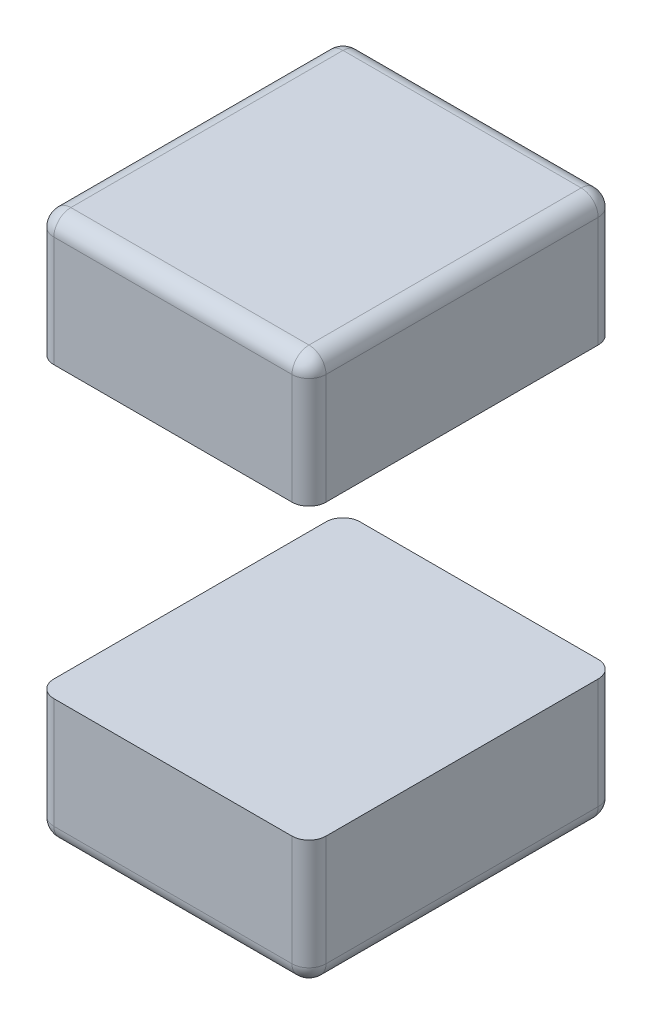
ISO-10303-21;
HEADER;
FILE_DESCRIPTION(('STEP AP214'),'2;1');
FILE_NAME('part.step','',(''),(''),'','','');
FILE_SCHEMA(('AUTOMOTIVE_DESIGN { 1 0 10303 214 1 1 1 1 }'));
ENDSEC;
DATA;
#1=APPLICATION_CONTEXT('core data for automotive mechanical design processes');
#2=APPLICATION_PROTOCOL_DEFINITION('international standard','automotive_design',2000,#1);
#3=PRODUCT_CONTEXT('',#1,'mechanical');
#4=PRODUCT('Part','Part','',(#3));
#5=PRODUCT_RELATED_PRODUCT_CATEGORY('part','',(#4));
#6=PRODUCT_DEFINITION_FORMATION('','',#4);
#7=PRODUCT_DEFINITION_CONTEXT('part definition',#1,'design');
#8=PRODUCT_DEFINITION('design','',#6,#7);
#9=PRODUCT_DEFINITION_SHAPE('','',#8);
#10=(LENGTH_UNIT() NAMED_UNIT(*) SI_UNIT(.MILLI.,.METRE.));
#11=(NAMED_UNIT(*) PLANE_ANGLE_UNIT() SI_UNIT($,.RADIAN.));
#12=(NAMED_UNIT(*) SI_UNIT($,.STERADIAN.) SOLID_ANGLE_UNIT());
#13=UNCERTAINTY_MEASURE_WITH_UNIT(LENGTH_MEASURE(1.E-05),#10,'distance_accuracy_value','');
#14=(GEOMETRIC_REPRESENTATION_CONTEXT(3) GLOBAL_UNCERTAINTY_ASSIGNED_CONTEXT((#13)) GLOBAL_UNIT_ASSIGNED_CONTEXT((#10,
#11,#12)) REPRESENTATION_CONTEXT('',''));
#15=CARTESIAN_POINT('',(0.,0.,0.));
#16=DIRECTION('',(0.,0.,1.));
#17=DIRECTION('',(1.,0.,0.));
#18=AXIS2_PLACEMENT_3D('',#15,#16,#17);
#19=CARTESIAN_POINT('',(18.593926876922,14.522666367789,0.));
#20=DIRECTION('',(4.371138863368E-08,-0.999999999999999,0.));
#21=DIRECTION('',(0.999999999999999,4.371138863368E-08,0.));
#22=AXIS2_PLACEMENT_3D('',#19,#20,#21);
#23=PLANE('',#22);
#24=DIRECTION('',(0.999999999999999,4.371138863368E-08,0.));
#25=VECTOR('',#24,1.);
#26=CARTESIAN_POINT('',(18.7939268769226,14.522666376531,0.85));
#27=LINE('',#26,#25);
#28=CARTESIAN_POINT('',(18.6439268769223,14.5226663699741,0.85));
#29=VERTEX_POINT('',#28);
#30=CARTESIAN_POINT('',(19.3439268769223,14.5226664005721,0.85));
#31=VERTEX_POINT('',#30);
#32=EDGE_CURVE('P0_E183',#29,#31,#27,.T.);
#33=ORIENTED_EDGE('',*,*,#32,.F.);
#34=DIRECTION('',(0.,0.,1.));
#35=VECTOR('',#34,1.);
#36=CARTESIAN_POINT('',(18.643926876922,14.522666369974,0.));
#37=LINE('',#36,#35);
#38=CARTESIAN_POINT('',(18.6439268769223,14.5226663699741,0.05));
#39=VERTEX_POINT('',#38);
#40=EDGE_CURVE('P0_E103',#39,#29,#37,.T.);
#41=ORIENTED_EDGE('',*,*,#40,.F.);
#42=DIRECTION('',(0.999999999999999,4.371138863368E-08,0.));
#43=VECTOR('',#42,1.);
#44=CARTESIAN_POINT('',(18.7939268769226,14.522666376531,0.05));
#45=LINE('',#44,#43);
#46=CARTESIAN_POINT('',(19.3439268769223,14.5226664005721,0.05));
#47=VERTEX_POINT('',#46);
#48=EDGE_CURVE('P0_E175',#47,#39,#45,.F.);
#49=ORIENTED_EDGE('',*,*,#48,.F.);
#50=DIRECTION('',(0.,0.,1.));
#51=VECTOR('',#50,1.);
#52=CARTESIAN_POINT('',(19.343926876922,14.522666400572,0.));
#53=LINE('',#52,#51);
#54=EDGE_CURVE('P0_E179',#31,#47,#53,.F.);
#55=ORIENTED_EDGE('',*,*,#54,.F.);
#56=EDGE_LOOP('',(#33,#41,#49,#55));
#57=FACE_BOUND('',#56,.T.);
#58=ADVANCED_FACE('P0_F17',(#57),#23,.T.);
#59=CARTESIAN_POINT('',(18.643926874737,14.572666369974,0.05));
#60=DIRECTION('',(-0.577350243952805,-0.577350294426266,-0.577350269189805));
#61=DIRECTION('',(0.707106781186693,3.09085931571307E-08,-0.707106781186401));
#62=AXIS2_PLACEMENT_3D('',#59,#60,#61);
#63=SPHERICAL_SURFACE('',#62,0.05);
#64=CARTESIAN_POINT('',(18.6150593625394,14.5437988552527,0.0211324865405095));
#65=VERTEX_POINT('',#64);
#66=VERTEX_LOOP('',#65);
#67=FACE_BOUND('',#66,.T.);
#68=CARTESIAN_POINT('',(18.6439268747363,14.572666369974,0.05));
#69=DIRECTION('',(4.371138837347E-08,-0.999999999999999,0.));
#70=DIRECTION('',(0.999999999999999,4.371138837347E-08,0.));
#71=AXIS2_PLACEMENT_3D('',#68,#69,#70);
#72=CIRCLE('',#71,0.05);
#73=CARTESIAN_POINT('',(18.6439268676332,14.5726663699741,0.));
#74=VERTEX_POINT('',#73);
#75=CARTESIAN_POINT('',(18.5939268747364,14.5726663677887,0.05));
#76=VERTEX_POINT('',#75);
#77=EDGE_CURVE('P0_E98',#74,#76,#72,.F.);
#78=ORIENTED_EDGE('',*,*,#77,.F.);
#79=CARTESIAN_POINT('',(18.6439268747364,14.5726663699743,0.05));
#80=DIRECTION('',(0.999999999999999,4.371138863368E-08,0.));
#81=DIRECTION('',(-4.371138863368E-08,0.999999999999999,0.));
#82=AXIS2_PLACEMENT_3D('',#79,#80,#81);
#83=CIRCLE('',#82,0.05);
#84=EDGE_CURVE('P0_E100',#39,#74,#83,.T.);
#85=ORIENTED_EDGE('',*,*,#84,.F.);
#86=CARTESIAN_POINT('',(18.643926874737,14.572666369974,0.05));
#87=DIRECTION('',(0.,0.,1.));
#88=DIRECTION('',(1.,0.,0.));
#89=AXIS2_PLACEMENT_3D('',#86,#87,#88);
#90=CIRCLE('',#89,0.05);
#91=EDGE_CURVE('P0_E20',#76,#39,#90,.T.);
#92=ORIENTED_EDGE('',*,*,#91,.F.);
#93=EDGE_LOOP('',(#78,#85,#92));
#94=FACE_BOUND('',#93,.T.);
#95=ADVANCED_FACE('P0_F97',(#67,#94),#63,.T.);
#96=CARTESIAN_POINT('',(18.643926874737,14.572666369974,0.));
#97=DIRECTION('',(0.,0.,1.));
#98=DIRECTION('',(1.,0.,0.));
#99=AXIS2_PLACEMENT_3D('',#96,#97,#98);
#100=CYLINDRICAL_SURFACE('',#99,0.05);
#101=ORIENTED_EDGE('',*,*,#91,.T.);
#102=ORIENTED_EDGE('',*,*,#40,.T.);
#103=CARTESIAN_POINT('',(18.643926874737,14.572666369974,0.85));
#104=DIRECTION('',(0.,0.,1.));
#105=DIRECTION('',(1.,0.,0.));
#106=AXIS2_PLACEMENT_3D('',#103,#104,#105);
#107=CIRCLE('',#106,0.05);
#108=CARTESIAN_POINT('',(18.5939268747364,14.5726663677887,0.85));
#109=VERTEX_POINT('',#108);
#110=EDGE_CURVE('P0_E118',#109,#29,#107,.T.);
#111=ORIENTED_EDGE('',*,*,#110,.F.);
#112=DIRECTION('',(0.,0.,1.));
#113=VECTOR('',#112,1.);
#114=CARTESIAN_POINT('',(18.5939268747362,14.572666367789,0.));
#115=LINE('',#114,#113);
#116=EDGE_CURVE('P0_E115',#76,#109,#115,.T.);
#117=ORIENTED_EDGE('',*,*,#116,.F.);
#118=EDGE_LOOP('',(#101,#102,#111,#117));
#119=FACE_BOUND('',#118,.T.);
#120=ADVANCED_FACE('P0_F116',(#119),#100,.T.);
#121=CARTESIAN_POINT('',(18.643926874737,14.572666369974,0.85));
#122=DIRECTION('',(-0.577350243952984,-0.577350294425946,0.577350269189946));
#123=DIRECTION('',(3.09081850113912E-08,-0.707106781186808,-0.707106781186286));
#124=AXIS2_PLACEMENT_3D('',#121,#122,#123);
#125=SPHERICAL_SURFACE('',#124,0.05);
#126=CARTESIAN_POINT('',(18.6150593625394,14.5437988552527,0.878867513459497));
#127=VERTEX_POINT('',#126);
#128=VERTEX_LOOP('',#127);
#129=FACE_BOUND('',#128,.T.);
#130=ORIENTED_EDGE('',*,*,#110,.T.);
#131=CARTESIAN_POINT('',(18.643926874737,14.5726663699743,0.85));
#132=DIRECTION('',(0.999999999999999,4.371138863368E-08,0.));
#133=DIRECTION('',(-4.371138863368E-08,0.999999999999999,0.));
#134=AXIS2_PLACEMENT_3D('',#131,#132,#133);
#135=CIRCLE('',#134,0.05);
#136=CARTESIAN_POINT('',(18.6439268676335,14.5726663699743,0.9));
#137=VERTEX_POINT('',#136);
#138=EDGE_CURVE('P0_E186',#137,#29,#135,.T.);
#139=ORIENTED_EDGE('',*,*,#138,.F.);
#140=CARTESIAN_POINT('',(18.6439268747363,14.5726663699746,0.85));
#141=DIRECTION('',(4.371138837347E-08,-0.999999999999999,0.));
#142=DIRECTION('',(0.999999999999999,4.371138837347E-08,0.));
#143=AXIS2_PLACEMENT_3D('',#140,#141,#142);
#144=CIRCLE('',#143,0.05);
#145=EDGE_CURVE('P0_E206',#109,#137,#144,.F.);
#146=ORIENTED_EDGE('',*,*,#145,.F.);
#147=EDGE_LOOP('',(#130,#139,#146));
#148=FACE_BOUND('',#147,.T.);
#149=ADVANCED_FACE('P0_F166',(#129,#148),#125,.T.);
#150=CARTESIAN_POINT('',(18.793926874737,14.572666376531,0.85));
#151=DIRECTION('',(0.999999999999999,4.371138863368E-08,0.));
#152=DIRECTION('',(-4.371138863368E-08,0.999999999999999,0.));
#153=AXIS2_PLACEMENT_3D('',#150,#151,#152);
#154=CYLINDRICAL_SURFACE('',#153,0.05);
#155=ORIENTED_EDGE('',*,*,#138,.T.);
#156=ORIENTED_EDGE('',*,*,#32,.T.);
#157=CARTESIAN_POINT('',(19.3439268747364,14.5726664005723,0.85));
#158=DIRECTION('',(0.999999999999999,4.371138863368E-08,0.));
#159=DIRECTION('',(-4.371138863368E-08,0.999999999999999,0.));
#160=AXIS2_PLACEMENT_3D('',#157,#158,#159);
#161=CIRCLE('',#160,0.05);
#162=CARTESIAN_POINT('',(19.3439268747367,14.5726663852731,0.9));
#163=VERTEX_POINT('',#162);
#164=EDGE_CURVE('P0_E185',#163,#31,#161,.T.);
#165=ORIENTED_EDGE('',*,*,#164,.F.);
#166=DIRECTION('',(1.,0.,0.));
#167=VECTOR('',#166,1.);
#168=CARTESIAN_POINT('',(18.993926868726,14.572666369974,0.9));
#169=LINE('',#168,#167);
#170=EDGE_CURVE('P0_E159',#137,#163,#169,.T.);
#171=ORIENTED_EDGE('',*,*,#170,.F.);
#172=EDGE_LOOP('',(#155,#156,#165,#171));
#173=FACE_BOUND('',#172,.T.);
#174=ADVANCED_FACE('P0_F154',(#173),#154,.T.);
#175=CARTESIAN_POINT('',(19.343926874737,14.572666400572,0.85));
#176=DIRECTION('',(0.577350294426125,-0.577350243953125,0.577350269189626));
#177=DIRECTION('',(-0.707106750278215,-0.707106812094878,-1.15130127653629E-13));
#178=AXIS2_PLACEMENT_3D('',#175,#176,#177);
#179=SPHERICAL_SURFACE('',#178,0.05);
#180=CARTESIAN_POINT('',(19.3727943894583,14.5437988883743,0.878867513459482));
#181=VERTEX_POINT('',#180);
#182=VERTEX_LOOP('',#181);
#183=FACE_BOUND('',#182,.T.);
#184=CARTESIAN_POINT('',(19.343926874737,14.572666400572,0.85));
#185=DIRECTION('',(0.,0.,1.));
#186=DIRECTION('',(1.,0.,0.));
#187=AXIS2_PLACEMENT_3D('',#184,#185,#186);
#188=CIRCLE('',#187,0.05);
#189=CARTESIAN_POINT('',(19.3939268747366,14.5726664027578,0.85));
#190=VERTEX_POINT('',#189);
#191=EDGE_CURVE('P0_E182',#190,#31,#188,.F.);
#192=ORIENTED_EDGE('',*,*,#191,.F.);
#193=CARTESIAN_POINT('',(19.3439268747364,14.572666400572,0.85));
#194=DIRECTION('',(-4.371138833011E-08,0.999999999999999,0.));
#195=DIRECTION('',(-0.999999999999999,-4.371138833011E-08,0.));
#196=AXIS2_PLACEMENT_3D('',#193,#194,#195);
#197=CIRCLE('',#196,0.05);
#198=EDGE_CURVE('P0_E202',#163,#190,#197,.T.);
#199=ORIENTED_EDGE('',*,*,#198,.F.);
#200=ORIENTED_EDGE('',*,*,#164,.T.);
#201=EDGE_LOOP('',(#192,#199,#200));
#202=FACE_BOUND('',#201,.T.);
#203=ADVANCED_FACE('P0_F150',(#183,#202),#179,.T.);
#204=CARTESIAN_POINT('',(19.343926874737,14.572666400572,0.));
#205=DIRECTION('',(0.,0.,1.));
#206=DIRECTION('',(1.,0.,0.));
#207=AXIS2_PLACEMENT_3D('',#204,#205,#206);
#208=CYLINDRICAL_SURFACE('',#207,0.05);
#209=CARTESIAN_POINT('',(19.343926874737,14.572666400572,0.05));
#210=DIRECTION('',(0.,0.,1.));
#211=DIRECTION('',(1.,0.,0.));
#212=AXIS2_PLACEMENT_3D('',#209,#210,#211);
#213=CIRCLE('',#212,0.05);
#214=CARTESIAN_POINT('',(19.3939268747365,14.5726664027578,0.05));
#215=VERTEX_POINT('',#214);
#216=EDGE_CURVE('P0_E181',#215,#47,#213,.F.);
#217=ORIENTED_EDGE('',*,*,#216,.F.);
#218=DIRECTION('',(0.,0.,1.));
#219=VECTOR('',#218,1.);
#220=CARTESIAN_POINT('',(19.3939268747364,14.572666402758,0.));
#221=LINE('',#220,#219);
#222=EDGE_CURVE('P0_E137',#190,#215,#221,.F.);
#223=ORIENTED_EDGE('',*,*,#222,.F.);
#224=ORIENTED_EDGE('',*,*,#191,.T.);
#225=ORIENTED_EDGE('',*,*,#54,.T.);
#226=EDGE_LOOP('',(#217,#223,#224,#225));
#227=FACE_BOUND('',#226,.T.);
#228=ADVANCED_FACE('P0_F145',(#227),#208,.T.);
#229=CARTESIAN_POINT('',(19.343926874737,14.572666400572,0.05));
#230=DIRECTION('',(0.577350294426125,-0.577350243953125,-0.577350269189626));
#231=DIRECTION('',(-0.707106750278215,-0.707106812094878,1.15130127653629E-13));
#232=AXIS2_PLACEMENT_3D('',#229,#230,#231);
#233=SPHERICAL_SURFACE('',#232,0.05);
#234=CARTESIAN_POINT('',(19.3727943894583,14.5437988883743,0.0211324865405184));
#235=VERTEX_POINT('',#234);
#236=VERTEX_LOOP('',#235);
#237=FACE_BOUND('',#236,.T.);
#238=CARTESIAN_POINT('',(19.3439268747364,14.5726664005724,0.05));
#239=DIRECTION('',(-4.371138833011E-08,0.999999999999999,0.));
#240=DIRECTION('',(-0.999999999999999,-4.371138833011E-08,0.));
#241=AXIS2_PLACEMENT_3D('',#238,#239,#240);
#242=CIRCLE('',#241,0.05);
#243=CARTESIAN_POINT('',(19.343926874737,14.5726663852732,0.));
#244=VERTEX_POINT('',#243);
#245=EDGE_CURVE('P0_E134',#215,#244,#242,.T.);
#246=ORIENTED_EDGE('',*,*,#245,.F.);
#247=ORIENTED_EDGE('',*,*,#216,.T.);
#248=CARTESIAN_POINT('',(19.343926874737,14.5726664005723,0.05));
#249=DIRECTION('',(0.999999999999999,4.371138863368E-08,0.));
#250=DIRECTION('',(-4.371138863368E-08,0.999999999999999,0.));
#251=AXIS2_PLACEMENT_3D('',#248,#249,#250);
#252=CIRCLE('',#251,0.05);
#253=EDGE_CURVE('P0_E178',#244,#47,#252,.F.);
#254=ORIENTED_EDGE('',*,*,#253,.F.);
#255=EDGE_LOOP('',(#246,#247,#254));
#256=FACE_BOUND('',#255,.T.);
#257=ADVANCED_FACE('P0_F140',(#237,#256),#233,.T.);
#258=CARTESIAN_POINT('',(18.793926874737,14.572666376531,0.05));
#259=DIRECTION('',(0.999999999999999,4.371138863368E-08,0.));
#260=DIRECTION('',(-4.371138863368E-08,0.999999999999999,0.));
#261=AXIS2_PLACEMENT_3D('',#258,#259,#260);
#262=CYLINDRICAL_SURFACE('',#261,0.05);
#263=ORIENTED_EDGE('',*,*,#84,.T.);
#264=DIRECTION('',(1.,0.,0.));
#265=VECTOR('',#264,1.);
#266=CARTESIAN_POINT('',(18.993926868726,14.572666369974,0.));
#267=LINE('',#266,#265);
#268=EDGE_CURVE('P0_E131',#74,#244,#267,.T.);
#269=ORIENTED_EDGE('',*,*,#268,.T.);
#270=ORIENTED_EDGE('',*,*,#253,.T.);
#271=ORIENTED_EDGE('',*,*,#48,.T.);
#272=EDGE_LOOP('',(#263,#269,#270,#271));
#273=FACE_BOUND('',#272,.T.);
#274=ADVANCED_FACE('P0_F144',(#273),#262,.T.);
#275=CARTESIAN_POINT('',(18.643926864628,14.803916369974,0.05));
#276=DIRECTION('',(4.371138837347E-08,-0.999999999999999,0.));
#277=DIRECTION('',(0.999999999999999,4.371138837347E-08,0.));
#278=AXIS2_PLACEMENT_3D('',#275,#276,#277);
#279=CYLINDRICAL_SURFACE('',#278,0.05);
#280=ORIENTED_EDGE('',*,*,#77,.T.);
#281=DIRECTION('',(4.371138837347E-08,-0.999999999999999,0.));
#282=VECTOR('',#281,1.);
#283=CARTESIAN_POINT('',(18.59392686053,14.897666367789,0.05));
#284=LINE('',#283,#282);
#285=CARTESIAN_POINT('',(18.59392686053,14.8976663677889,0.05));
#286=VERTEX_POINT('',#285);
#287=EDGE_CURVE('P0_E108',#286,#76,#284,.T.);
#288=ORIENTED_EDGE('',*,*,#287,.F.);
#289=CARTESIAN_POINT('',(18.6439268605301,14.8976663699746,0.05));
#290=DIRECTION('',(4.371138837347E-08,-0.999999999999999,0.));
#291=DIRECTION('',(0.999999999999999,4.371138837347E-08,0.));
#292=AXIS2_PLACEMENT_3D('',#289,#290,#291);
#293=CIRCLE('',#292,0.05);
#294=CARTESIAN_POINT('',(18.64392686053,14.8976663699745,0.));
#295=VERTEX_POINT('',#294);
#296=EDGE_CURVE('P0_E198',#295,#286,#293,.F.);
#297=ORIENTED_EDGE('',*,*,#296,.F.);
#298=DIRECTION('',(0.,1.,0.));
#299=VECTOR('',#298,1.);
#300=CARTESIAN_POINT('',(18.64392686053,14.710166385273,0.));
#301=LINE('',#300,#299);
#302=EDGE_CURVE('P0_E111',#295,#74,#301,.F.);
#303=ORIENTED_EDGE('',*,*,#302,.T.);
#304=EDGE_LOOP('',(#280,#288,#297,#303));
#305=FACE_BOUND('',#304,.T.);
#306=ADVANCED_FACE('P0_F106',(#305),#279,.T.);
#307=CARTESIAN_POINT('',(18.59392686053,14.897666367789,0.));
#308=DIRECTION('',(-0.999999999999999,-4.371138837347E-08,0.));
#309=DIRECTION('',(4.371138837347E-08,-0.999999999999999,0.));
#310=AXIS2_PLACEMENT_3D('',#307,#308,#309);
#311=PLANE('',#310);
#312=DIRECTION('',(4.371138837347E-08,-0.999999999999999,0.));
#313=VECTOR('',#312,1.);
#314=CARTESIAN_POINT('',(18.593926864628,14.8039163677884,0.85));
#315=LINE('',#314,#313);
#316=CARTESIAN_POINT('',(18.59392686053,14.8976663677887,0.85));
#317=VERTEX_POINT('',#316);
#318=EDGE_CURVE('P0_E121',#317,#109,#315,.T.);
#319=ORIENTED_EDGE('',*,*,#318,.F.);
#320=DIRECTION('',(0.,0.,1.));
#321=VECTOR('',#320,1.);
#322=CARTESIAN_POINT('',(18.59392686053,14.8976663677889,0.));
#323=LINE('',#322,#321);
#324=EDGE_CURVE('P0_E125',#286,#317,#323,.T.);
#325=ORIENTED_EDGE('',*,*,#324,.F.);
#326=ORIENTED_EDGE('',*,*,#287,.T.);
#327=ORIENTED_EDGE('',*,*,#116,.T.);
#328=EDGE_LOOP('',(#319,#325,#326,#327));
#329=FACE_BOUND('',#328,.T.);
#330=ADVANCED_FACE('P0_F123',(#329),#311,.T.);
#331=CARTESIAN_POINT('',(18.643926864628,14.803916369974,0.85));
#332=DIRECTION('',(4.371138837347E-08,-0.999999999999999,0.));
#333=DIRECTION('',(0.999999999999999,4.371138837347E-08,0.));
#334=AXIS2_PLACEMENT_3D('',#331,#332,#333);
#335=CYLINDRICAL_SURFACE('',#334,0.05);
#336=ORIENTED_EDGE('',*,*,#145,.T.);
#337=DIRECTION('',(0.,1.,0.));
#338=VECTOR('',#337,1.);
#339=CARTESIAN_POINT('',(18.64392686053,14.710166385273,0.9));
#340=LINE('',#339,#338);
#341=CARTESIAN_POINT('',(18.64392686053,14.8976663699742,0.9));
#342=VERTEX_POINT('',#341);
#343=EDGE_CURVE('P0_E163',#342,#137,#340,.F.);
#344=ORIENTED_EDGE('',*,*,#343,.F.);
#345=CARTESIAN_POINT('',(18.6439268605301,14.897666369974,0.85));
#346=DIRECTION('',(4.371138837347E-08,-0.999999999999999,0.));
#347=DIRECTION('',(0.999999999999999,4.371138837347E-08,0.));
#348=AXIS2_PLACEMENT_3D('',#345,#346,#347);
#349=CIRCLE('',#348,0.05);
#350=EDGE_CURVE('P0_E195',#317,#342,#349,.F.);
#351=ORIENTED_EDGE('',*,*,#350,.F.);
#352=ORIENTED_EDGE('',*,*,#318,.T.);
#353=EDGE_LOOP('',(#336,#344,#351,#352));
#354=FACE_BOUND('',#353,.T.);
#355=ADVANCED_FACE('P0_F311',(#354),#335,.T.);
#356=CARTESIAN_POINT('',(18.993926868726,14.710166385273,0.9));
#357=DIRECTION('',(0.,0.,1.));
#358=DIRECTION('',(1.,0.,0.));
#359=AXIS2_PLACEMENT_3D('',#356,#357,#358);
#360=PLANE('',#359);
#361=DIRECTION('',(-4.371138833011E-08,0.999999999999999,0.));
#362=VECTOR('',#361,1.);
#363=CARTESIAN_POINT('',(19.3439268728238,14.616416400572,0.9));
#364=LINE('',#363,#362);
#365=CARTESIAN_POINT('',(19.3439268605301,14.8976664005724,0.9));
#366=VERTEX_POINT('',#365);
#367=EDGE_CURVE('P0_E162',#366,#163,#364,.F.);
#368=ORIENTED_EDGE('',*,*,#367,.F.);
#369=DIRECTION('',(-0.999999999999999,-4.371138828674E-08,0.));
#370=VECTOR('',#369,1.);
#371=CARTESIAN_POINT('',(19.39392686053,14.897666402758,0.9));
#372=LINE('',#371,#370);
#373=EDGE_CURVE('P0_E194',#342,#366,#372,.F.);
#374=ORIENTED_EDGE('',*,*,#373,.F.);
#375=ORIENTED_EDGE('',*,*,#343,.T.);
#376=ORIENTED_EDGE('',*,*,#170,.T.);
#377=EDGE_LOOP('',(#368,#374,#375,#376));
#378=FACE_BOUND('',#377,.T.);
#379=ADVANCED_FACE('P0_F232',(#378),#360,.T.);
#380=CARTESIAN_POINT('',(19.343926872824,14.616416400572,0.85));
#381=DIRECTION('',(-4.371138833011E-08,0.999999999999999,0.));
#382=DIRECTION('',(-0.999999999999999,-4.371138833011E-08,0.));
#383=AXIS2_PLACEMENT_3D('',#380,#381,#382);
#384=CYLINDRICAL_SURFACE('',#383,0.05);
#385=ORIENTED_EDGE('',*,*,#198,.T.);
#386=DIRECTION('',(-4.371138833011E-08,0.999999999999999,0.));
#387=VECTOR('',#386,1.);
#388=CARTESIAN_POINT('',(19.393926876922,14.522666402758,0.85));
#389=LINE('',#388,#387);
#390=CARTESIAN_POINT('',(19.3939268605301,14.897666402758,0.85));
#391=VERTEX_POINT('',#390);
#392=EDGE_CURVE('P0_E205',#391,#190,#389,.F.);
#393=ORIENTED_EDGE('',*,*,#392,.F.);
#394=CARTESIAN_POINT('',(19.3439268605302,14.8976664005724,0.85));
#395=DIRECTION('',(-4.371138833011E-08,0.999999999999999,0.));
#396=DIRECTION('',(-0.999999999999999,-4.371138833011E-08,0.));
#397=AXIS2_PLACEMENT_3D('',#394,#395,#396);
#398=CIRCLE('',#397,0.05);
#399=EDGE_CURVE('P0_E191',#366,#391,#398,.T.);
#400=ORIENTED_EDGE('',*,*,#399,.F.);
#401=ORIENTED_EDGE('',*,*,#367,.T.);
#402=EDGE_LOOP('',(#385,#393,#400,#401));
#403=FACE_BOUND('',#402,.T.);
#404=ADVANCED_FACE('P0_F268',(#403),#384,.T.);
#405=CARTESIAN_POINT('',(19.393926876922,14.522666402758,0.));
#406=DIRECTION('',(0.999999999999999,4.371138833011E-08,0.));
#407=DIRECTION('',(-4.371138833011E-08,0.999999999999999,0.));
#408=AXIS2_PLACEMENT_3D('',#405,#406,#407);
#409=PLANE('',#408);
#410=ORIENTED_EDGE('',*,*,#392,.T.);
#411=ORIENTED_EDGE('',*,*,#222,.T.);
#412=DIRECTION('',(-4.371138833011E-08,0.999999999999999,0.));
#413=VECTOR('',#412,1.);
#414=CARTESIAN_POINT('',(19.393926872824,14.6164164027576,0.05));
#415=LINE('',#414,#413);
#416=CARTESIAN_POINT('',(19.39392686053,14.8976664027578,0.05));
#417=VERTEX_POINT('',#416);
#418=EDGE_CURVE('P0_E201',#417,#215,#415,.F.);
#419=ORIENTED_EDGE('',*,*,#418,.F.);
#420=DIRECTION('',(0.,0.,1.));
#421=VECTOR('',#420,1.);
#422=CARTESIAN_POINT('',(19.39392686053,14.897666402758,0.));
#423=LINE('',#422,#421);
#424=EDGE_CURVE('P0_E190',#391,#417,#423,.F.);
#425=ORIENTED_EDGE('',*,*,#424,.F.);
#426=EDGE_LOOP('',(#410,#411,#419,#425));
#427=FACE_BOUND('',#426,.T.);
#428=ADVANCED_FACE('P0_F253',(#427),#409,.T.);
#429=CARTESIAN_POINT('',(19.343926872824,14.616416400572,0.05));
#430=DIRECTION('',(-4.371138833011E-08,0.999999999999999,0.));
#431=DIRECTION('',(-0.999999999999999,-4.371138833011E-08,0.));
#432=AXIS2_PLACEMENT_3D('',#429,#430,#431);
#433=CYLINDRICAL_SURFACE('',#432,0.05);
#434=ORIENTED_EDGE('',*,*,#245,.T.);
#435=DIRECTION('',(0.,1.,0.));
#436=VECTOR('',#435,1.);
#437=CARTESIAN_POINT('',(19.343926874737,14.710166385273,0.));
#438=LINE('',#437,#436);
#439=CARTESIAN_POINT('',(19.3439268676336,14.8976664005722,0.));
#440=VERTEX_POINT('',#439);
#441=EDGE_CURVE('P0_E35',#244,#440,#438,.T.);
#442=ORIENTED_EDGE('',*,*,#441,.T.);
#443=CARTESIAN_POINT('',(19.3439268605302,14.897666400572,0.05));
#444=DIRECTION('',(-4.371138833011E-08,0.999999999999999,0.));
#445=DIRECTION('',(-0.999999999999999,-4.371138833011E-08,0.));
#446=AXIS2_PLACEMENT_3D('',#443,#444,#445);
#447=CIRCLE('',#446,0.05);
#448=EDGE_CURVE('P0_E26',#417,#440,#447,.T.);
#449=ORIENTED_EDGE('',*,*,#448,.F.);
#450=ORIENTED_EDGE('',*,*,#418,.T.);
#451=EDGE_LOOP('',(#434,#442,#449,#450));
#452=FACE_BOUND('',#451,.T.);
#453=ADVANCED_FACE('P0_F257',(#452),#433,.T.);
#454=CARTESIAN_POINT('',(18.993926868726,14.710166385273,0.));
#455=DIRECTION('',(0.,0.,1.));
#456=DIRECTION('',(1.,0.,0.));
#457=AXIS2_PLACEMENT_3D('',#454,#455,#456);
#458=PLANE('',#457);
#459=DIRECTION('',(-0.999999999999999,-4.371138828674E-08,0.));
#460=VECTOR('',#459,1.);
#461=CARTESIAN_POINT('',(19.39392686053,14.897666402758,0.));
#462=LINE('',#461,#460);
#463=EDGE_CURVE('P0_E11',#440,#295,#462,.T.);
#464=ORIENTED_EDGE('',*,*,#463,.F.);
#465=ORIENTED_EDGE('',*,*,#441,.F.);
#466=ORIENTED_EDGE('',*,*,#268,.F.);
#467=ORIENTED_EDGE('',*,*,#302,.F.);
#468=EDGE_LOOP('',(#464,#465,#466,#467));
#469=FACE_BOUND('',#468,.T.);
#470=ADVANCED_FACE('P0_F259',(#469),#458,.F.);
#471=CARTESIAN_POINT('',(19.39392686053,14.897666402758,0.));
#472=DIRECTION('',(-4.371138828674E-08,0.999999999999999,0.));
#473=DIRECTION('',(-0.999999999999999,-4.371138828674E-08,0.));
#474=AXIS2_PLACEMENT_3D('',#471,#472,#473);
#475=PLANE('',#474);
#476=ORIENTED_EDGE('',*,*,#448,.T.);
#477=ORIENTED_EDGE('',*,*,#463,.T.);
#478=ORIENTED_EDGE('',*,*,#296,.T.);
#479=ORIENTED_EDGE('',*,*,#324,.T.);
#480=ORIENTED_EDGE('',*,*,#350,.T.);
#481=ORIENTED_EDGE('',*,*,#373,.T.);
#482=ORIENTED_EDGE('',*,*,#399,.T.);
#483=ORIENTED_EDGE('',*,*,#424,.T.);
#484=EDGE_LOOP('',(#476,#477,#478,#479,#480,#481,#482,#483));
#485=FACE_BOUND('',#484,.T.);
#486=ADVANCED_FACE('P0_F250',(#485),#475,.T.);
#487=CLOSED_SHELL('',(#58,#95,#120,#149,#174,#203,#228,#257,#274,#306,#330,#355,#379,#404,#428,
#453,#470,#486));
#488=MANIFOLD_SOLID_BREP('P0_B1',#487);
#489=CARTESIAN_POINT('',(19.393926806984,16.122666402758,0.));
#490=DIRECTION('',(-4.371138828674E-08,0.999999999999999,0.));
#491=DIRECTION('',(-0.999999999999999,-4.371138828674E-08,0.));
#492=AXIS2_PLACEMENT_3D('',#489,#490,#491);
#493=PLANE('',#492);
#494=DIRECTION('',(-0.999999999999999,-4.371138828674E-08,0.));
#495=VECTOR('',#494,1.);
#496=CARTESIAN_POINT('',(19.1939268069844,16.122666394016,0.85));
#497=LINE('',#496,#495);
#498=CARTESIAN_POINT('',(19.3439268069842,16.1226664005724,0.85));
#499=VERTEX_POINT('',#498);
#500=CARTESIAN_POINT('',(18.6439268069842,16.1226663699744,0.85));
#501=VERTEX_POINT('',#500);
#502=EDGE_CURVE('P1_E180',#499,#501,#497,.T.);
#503=ORIENTED_EDGE('',*,*,#502,.F.);
#504=DIRECTION('',(0.,0.,1.));
#505=VECTOR('',#504,1.);
#506=CARTESIAN_POINT('',(19.343926806984,16.122666400572,0.));
#507=LINE('',#506,#505);
#508=CARTESIAN_POINT('',(19.3439268069842,16.1226664005724,0.05));
#509=VERTEX_POINT('',#508);
#510=EDGE_CURVE('P1_E184',#509,#499,#507,.T.);
#511=ORIENTED_EDGE('',*,*,#510,.F.);
#512=DIRECTION('',(-0.999999999999999,-4.371138828674E-08,0.));
#513=VECTOR('',#512,1.);
#514=CARTESIAN_POINT('',(19.1939268069844,16.122666394016,0.05));
#515=LINE('',#514,#513);
#516=CARTESIAN_POINT('',(18.6439268069842,16.1226663699744,0.05));
#517=VERTEX_POINT('',#516);
#518=EDGE_CURVE('P1_E104',#517,#509,#515,.F.);
#519=ORIENTED_EDGE('',*,*,#518,.F.);
#520=DIRECTION('',(0.,0.,1.));
#521=VECTOR('',#520,1.);
#522=CARTESIAN_POINT('',(18.643926806984,16.122666369974,0.));
#523=LINE('',#522,#521);
#524=EDGE_CURVE('P1_E176',#501,#517,#523,.F.);
#525=ORIENTED_EDGE('',*,*,#524,.F.);
#526=EDGE_LOOP('',(#503,#511,#519,#525));
#527=FACE_BOUND('',#526,.T.);
#528=ADVANCED_FACE('P1_F17',(#527),#493,.T.);
#529=CARTESIAN_POINT('',(18.64392680917,16.072666369974,0.05));
#530=DIRECTION('',(-0.577350294425946,0.577350243952984,-0.577350269189946));
#531=DIRECTION('',(0.707106781186808,3.09081850113912E-08,-0.707106781186286));
#532=AXIS2_PLACEMENT_3D('',#529,#530,#531);
#533=SPHERICAL_SURFACE('',#532,0.05);
#534=CARTESIAN_POINT('',(18.6150592944487,16.1015338821717,0.0211324865405037));
#535=VERTEX_POINT('',#534);
#536=VERTEX_LOOP('',#535);
#537=FACE_BOUND('',#536,.T.);
#538=CARTESIAN_POINT('',(18.64392680917,16.0726663699747,0.05));
#539=DIRECTION('',(-0.999999999999999,-4.371138828674E-08,0.));
#540=DIRECTION('',(4.371138828674E-08,-0.999999999999999,0.));
#541=AXIS2_PLACEMENT_3D('',#538,#539,#540);
#542=CIRCLE('',#541,0.05);
#543=CARTESIAN_POINT('',(18.64392680917,16.072666385273,0.));
#544=VERTEX_POINT('',#543);
#545=EDGE_CURVE('P1_E20',#544,#517,#542,.F.);
#546=ORIENTED_EDGE('',*,*,#545,.F.);
#547=CARTESIAN_POINT('',(18.6439268091696,16.0726663699746,0.05));
#548=DIRECTION('',(4.371138837347E-08,-0.999999999999999,0.));
#549=DIRECTION('',(0.999999999999999,4.371138837347E-08,0.));
#550=AXIS2_PLACEMENT_3D('',#547,#548,#549);
#551=CIRCLE('',#550,0.05);
#552=CARTESIAN_POINT('',(18.5939268091697,16.0726663677887,0.05));
#553=VERTEX_POINT('',#552);
#554=EDGE_CURVE('P1_E99',#553,#544,#551,.T.);
#555=ORIENTED_EDGE('',*,*,#554,.F.);
#556=CARTESIAN_POINT('',(18.64392680917,16.072666369974,0.05));
#557=DIRECTION('',(0.,0.,1.));
#558=DIRECTION('',(1.,0.,0.));
#559=AXIS2_PLACEMENT_3D('',#556,#557,#558);
#560=CIRCLE('',#559,0.05);
#561=EDGE_CURVE('P1_E102',#517,#553,#560,.T.);
#562=ORIENTED_EDGE('',*,*,#561,.F.);
#563=EDGE_LOOP('',(#546,#555,#562));
#564=FACE_BOUND('',#563,.T.);
#565=ADVANCED_FACE('P1_F97',(#537,#564),#533,.T.);
#566=CARTESIAN_POINT('',(19.19392680917,16.072666394016,0.05));
#567=DIRECTION('',(-0.999999999999999,-4.371138828674E-08,0.));
#568=DIRECTION('',(4.371138828674E-08,-0.999999999999999,0.));
#569=AXIS2_PLACEMENT_3D('',#566,#567,#568);
#570=CYLINDRICAL_SURFACE('',#569,0.05);
#571=CARTESIAN_POINT('',(19.3439268091696,16.0726664005727,0.05));
#572=DIRECTION('',(-0.999999999999999,-4.371138828674E-08,0.));
#573=DIRECTION('',(4.371138828674E-08,-0.999999999999999,0.));
#574=AXIS2_PLACEMENT_3D('',#571,#572,#573);
#575=CIRCLE('',#574,0.05);
#576=CARTESIAN_POINT('',(19.3439268162728,16.0726664005724,0.));
#577=VERTEX_POINT('',#576);
#578=EDGE_CURVE('P1_E109',#577,#509,#575,.F.);
#579=ORIENTED_EDGE('',*,*,#578,.F.);
#580=DIRECTION('',(1.,0.,0.));
#581=VECTOR('',#580,1.);
#582=CARTESIAN_POINT('',(18.99392681518,16.072666400572,0.));
#583=LINE('',#582,#581);
#584=EDGE_CURVE('P1_E106',#577,#544,#583,.F.);
#585=ORIENTED_EDGE('',*,*,#584,.T.);
#586=ORIENTED_EDGE('',*,*,#545,.T.);
#587=ORIENTED_EDGE('',*,*,#518,.T.);
#588=EDGE_LOOP('',(#579,#585,#586,#587));
#589=FACE_BOUND('',#588,.T.);
#590=ADVANCED_FACE('P1_F107',(#589),#570,.T.);
#591=CARTESIAN_POINT('',(19.34392680917,16.072666400572,0.05));
#592=DIRECTION('',(0.577350243952805,0.577350294426266,-0.577350269189805));
#593=DIRECTION('',(0.707106781186693,3.09085931571307E-08,0.707106781186401));
#594=AXIS2_PLACEMENT_3D('',#591,#592,#593);
#595=SPHERICAL_SURFACE('',#594,0.05);
#596=CARTESIAN_POINT('',(19.3727943213676,16.1015339152933,0.0211324865405095));
#597=VERTEX_POINT('',#596);
#598=VERTEX_LOOP('',#597);
#599=FACE_BOUND('',#598,.T.);
#600=ORIENTED_EDGE('',*,*,#578,.T.);
#601=CARTESIAN_POINT('',(19.34392680917,16.072666400572,0.05));
#602=DIRECTION('',(0.,0.,1.));
#603=DIRECTION('',(1.,0.,0.));
#604=AXIS2_PLACEMENT_3D('',#601,#602,#603);
#605=CIRCLE('',#604,0.05);
#606=CARTESIAN_POINT('',(19.3939268091698,16.0726664027578,0.05));
#607=VERTEX_POINT('',#606);
#608=EDGE_CURVE('P1_E187',#607,#509,#605,.T.);
#609=ORIENTED_EDGE('',*,*,#608,.F.);
#610=CARTESIAN_POINT('',(19.3439268091697,16.072666400572,0.05));
#611=DIRECTION('',(-4.371138833011E-08,0.999999999999999,0.));
#612=DIRECTION('',(-0.999999999999999,-4.371138833011E-08,0.));
#613=AXIS2_PLACEMENT_3D('',#610,#611,#612);
#614=CIRCLE('',#613,0.05);
#615=EDGE_CURVE('P1_E128',#577,#607,#614,.F.);
#616=ORIENTED_EDGE('',*,*,#615,.F.);
#617=EDGE_LOOP('',(#600,#609,#616));
#618=FACE_BOUND('',#617,.T.);
#619=ADVANCED_FACE('P1_F167',(#599,#618),#595,.T.);
#620=CARTESIAN_POINT('',(19.34392680917,16.072666400572,0.));
#621=DIRECTION('',(0.,0.,1.));
#622=DIRECTION('',(1.,0.,0.));
#623=AXIS2_PLACEMENT_3D('',#620,#621,#622);
#624=CYLINDRICAL_SURFACE('',#623,0.05);
#625=ORIENTED_EDGE('',*,*,#608,.T.);
#626=ORIENTED_EDGE('',*,*,#510,.T.);
#627=CARTESIAN_POINT('',(19.34392680917,16.072666400572,0.85));
#628=DIRECTION('',(0.,0.,1.));
#629=DIRECTION('',(1.,0.,0.));
#630=AXIS2_PLACEMENT_3D('',#627,#628,#629);
#631=CIRCLE('',#630,0.05);
#632=CARTESIAN_POINT('',(19.3939268091698,16.0726664027578,0.85));
#633=VERTEX_POINT('',#632);
#634=EDGE_CURVE('P1_E186',#633,#499,#631,.T.);
#635=ORIENTED_EDGE('',*,*,#634,.F.);
#636=DIRECTION('',(0.,0.,1.));
#637=VECTOR('',#636,1.);
#638=CARTESIAN_POINT('',(19.3939268091698,16.072666402758,0.));
#639=LINE('',#638,#637);
#640=EDGE_CURVE('P1_E160',#607,#633,#639,.T.);
#641=ORIENTED_EDGE('',*,*,#640,.F.);
#642=EDGE_LOOP('',(#625,#626,#635,#641));
#643=FACE_BOUND('',#642,.T.);
#644=ADVANCED_FACE('P1_F155',(#643),#624,.T.);
#645=CARTESIAN_POINT('',(19.34392680917,16.072666400572,0.85));
#646=DIRECTION('',(0.577350243952984,0.577350294425946,0.577350269189946));
#647=DIRECTION('',(3.09081850113912E-08,-0.707106781186808,0.707106781186286));
#648=AXIS2_PLACEMENT_3D('',#645,#646,#647);
#649=SPHERICAL_SURFACE('',#648,0.05);
#650=CARTESIAN_POINT('',(19.3727943213676,16.1015339152933,0.878867513459496));
#651=VERTEX_POINT('',#650);
#652=VERTEX_LOOP('',#651);
#653=FACE_BOUND('',#652,.T.);
#654=ORIENTED_EDGE('',*,*,#634,.T.);
#655=CARTESIAN_POINT('',(19.34392680917,16.0726664005727,0.85));
#656=DIRECTION('',(-0.999999999999999,-4.371138828674E-08,0.));
#657=DIRECTION('',(4.371138828674E-08,-0.999999999999999,0.));
#658=AXIS2_PLACEMENT_3D('',#655,#656,#657);
#659=CIRCLE('',#658,0.05);
#660=CARTESIAN_POINT('',(19.3439268162729,16.0726664005722,0.9));
#661=VERTEX_POINT('',#660);
#662=EDGE_CURVE('P1_E183',#661,#499,#659,.T.);
#663=ORIENTED_EDGE('',*,*,#662,.F.);
#664=CARTESIAN_POINT('',(19.3439268091697,16.0726664005724,0.85));
#665=DIRECTION('',(-4.371138833011E-08,0.999999999999999,0.));
#666=DIRECTION('',(-0.999999999999999,-4.371138833011E-08,0.));
#667=AXIS2_PLACEMENT_3D('',#664,#665,#666);
#668=CIRCLE('',#667,0.05);
#669=EDGE_CURVE('P1_E203',#633,#661,#668,.F.);
#670=ORIENTED_EDGE('',*,*,#669,.F.);
#671=EDGE_LOOP('',(#654,#663,#670));
#672=FACE_BOUND('',#671,.T.);
#673=ADVANCED_FACE('P1_F151',(#653,#672),#649,.T.);
#674=CARTESIAN_POINT('',(19.19392680917,16.072666394016,0.85));
#675=DIRECTION('',(-0.999999999999999,-4.371138828674E-08,0.));
#676=DIRECTION('',(4.371138828674E-08,-0.999999999999999,0.));
#677=AXIS2_PLACEMENT_3D('',#674,#675,#676);
#678=CYLINDRICAL_SURFACE('',#677,0.05);
#679=ORIENTED_EDGE('',*,*,#662,.T.);
#680=ORIENTED_EDGE('',*,*,#502,.T.);
#681=CARTESIAN_POINT('',(18.6439268091696,16.0726663699747,0.85));
#682=DIRECTION('',(-0.999999999999999,-4.371138828674E-08,0.));
#683=DIRECTION('',(4.371138828674E-08,-0.999999999999999,0.));
#684=AXIS2_PLACEMENT_3D('',#681,#682,#683);
#685=CIRCLE('',#684,0.05);
#686=CARTESIAN_POINT('',(18.6439268091698,16.072666385273,0.9));
#687=VERTEX_POINT('',#686);
#688=EDGE_CURVE('P1_E182',#687,#501,#685,.T.);
#689=ORIENTED_EDGE('',*,*,#688,.F.);
#690=DIRECTION('',(1.,0.,0.));
#691=VECTOR('',#690,1.);
#692=CARTESIAN_POINT('',(18.99392681518,16.072666400572,0.9));
#693=LINE('',#692,#691);
#694=EDGE_CURVE('P1_E138',#661,#687,#693,.F.);
#695=ORIENTED_EDGE('',*,*,#694,.F.);
#696=EDGE_LOOP('',(#679,#680,#689,#695));
#697=FACE_BOUND('',#696,.T.);
#698=ADVANCED_FACE('P1_F146',(#697),#678,.T.);
#699=CARTESIAN_POINT('',(18.64392680917,16.072666369974,0.85));
#700=DIRECTION('',(-0.577350294426266,0.577350243952805,0.577350269189805));
#701=DIRECTION('',(3.09085931571307E-08,-0.707106781186693,0.707106781186401));
#702=AXIS2_PLACEMENT_3D('',#699,#700,#701);
#703=SPHERICAL_SURFACE('',#702,0.05);
#704=CARTESIAN_POINT('',(18.6150592944487,16.1015338821716,0.87886751345949));
#705=VERTEX_POINT('',#704);
#706=VERTEX_LOOP('',#705);
#707=FACE_BOUND('',#706,.T.);
#708=CARTESIAN_POINT('',(18.64392680917,16.072666369974,0.85));
#709=DIRECTION('',(0.,0.,1.));
#710=DIRECTION('',(1.,0.,0.));
#711=AXIS2_PLACEMENT_3D('',#708,#709,#710);
#712=CIRCLE('',#711,0.05);
#713=CARTESIAN_POINT('',(18.5939268091697,16.0726663677887,0.85));
#714=VERTEX_POINT('',#713);
#715=EDGE_CURVE('P1_E179',#714,#501,#712,.F.);
#716=ORIENTED_EDGE('',*,*,#715,.F.);
#717=CARTESIAN_POINT('',(18.6439268091696,16.072666369974,0.85));
#718=DIRECTION('',(4.371138837347E-08,-0.999999999999999,0.));
#719=DIRECTION('',(0.999999999999999,4.371138837347E-08,0.));
#720=AXIS2_PLACEMENT_3D('',#717,#718,#719);
#721=CIRCLE('',#720,0.05);
#722=EDGE_CURVE('P1_E200',#687,#714,#721,.T.);
#723=ORIENTED_EDGE('',*,*,#722,.F.);
#724=ORIENTED_EDGE('',*,*,#688,.T.);
#725=EDGE_LOOP('',(#716,#723,#724));
#726=FACE_BOUND('',#725,.T.);
#727=ADVANCED_FACE('P1_F141',(#707,#726),#703,.T.);
#728=CARTESIAN_POINT('',(18.64392680917,16.072666369974,0.));
#729=DIRECTION('',(0.,0.,1.));
#730=DIRECTION('',(1.,0.,0.));
#731=AXIS2_PLACEMENT_3D('',#728,#729,#730);
#732=CYLINDRICAL_SURFACE('',#731,0.05);
#733=ORIENTED_EDGE('',*,*,#561,.T.);
#734=DIRECTION('',(0.,0.,1.));
#735=VECTOR('',#734,1.);
#736=CARTESIAN_POINT('',(18.5939268091696,16.072666367789,0.));
#737=LINE('',#736,#735);
#738=EDGE_CURVE('P1_E132',#714,#553,#737,.F.);
#739=ORIENTED_EDGE('',*,*,#738,.F.);
#740=ORIENTED_EDGE('',*,*,#715,.T.);
#741=ORIENTED_EDGE('',*,*,#524,.T.);
#742=EDGE_LOOP('',(#733,#739,#740,#741));
#743=FACE_BOUND('',#742,.T.);
#744=ADVANCED_FACE('P1_F145',(#743),#732,.T.);
#745=CARTESIAN_POINT('',(18.643926811082,16.028916369974,0.05));
#746=DIRECTION('',(4.371138837347E-08,-0.999999999999999,0.));
#747=DIRECTION('',(0.999999999999999,4.371138837347E-08,0.));
#748=AXIS2_PLACEMENT_3D('',#745,#746,#747);
#749=CYLINDRICAL_SURFACE('',#748,0.05);
#750=ORIENTED_EDGE('',*,*,#554,.T.);
#751=DIRECTION('',(0.,1.,0.));
#752=VECTOR('',#751,1.);
#753=CARTESIAN_POINT('',(18.64392680917,15.935166385273,0.));
#754=LINE('',#753,#752);
#755=CARTESIAN_POINT('',(18.6439268162729,15.7476663699743,0.));
#756=VERTEX_POINT('',#755);
#757=EDGE_CURVE('P1_E113',#544,#756,#754,.F.);
#758=ORIENTED_EDGE('',*,*,#757,.T.);
#759=CARTESIAN_POINT('',(18.6439268233758,15.747666369974,0.05));
#760=DIRECTION('',(4.371138837347E-08,-0.999999999999999,0.));
#761=DIRECTION('',(0.999999999999999,4.371138837347E-08,0.));
#762=AXIS2_PLACEMENT_3D('',#759,#760,#761);
#763=CIRCLE('',#762,0.05);
#764=CARTESIAN_POINT('',(18.5939268233759,15.7476663677887,0.05));
#765=VERTEX_POINT('',#764);
#766=EDGE_CURVE('P1_E135',#765,#756,#763,.T.);
#767=ORIENTED_EDGE('',*,*,#766,.F.);
#768=DIRECTION('',(4.371138837347E-08,-0.999999999999999,0.));
#769=VECTOR('',#768,1.);
#770=CARTESIAN_POINT('',(18.593926806984,16.122666367789,0.05));
#771=LINE('',#770,#769);
#772=EDGE_CURVE('P1_E119',#553,#765,#771,.T.);
#773=ORIENTED_EDGE('',*,*,#772,.F.);
#774=EDGE_LOOP('',(#750,#758,#767,#773));
#775=FACE_BOUND('',#774,.T.);
#776=ADVANCED_FACE('P1_F116',(#775),#749,.T.);
#777=CARTESIAN_POINT('',(18.99392681518,15.935166385273,0.));
#778=DIRECTION('',(0.,0.,1.));
#779=DIRECTION('',(1.,0.,0.));
#780=AXIS2_PLACEMENT_3D('',#777,#778,#779);
#781=PLANE('',#780);
#782=ORIENTED_EDGE('',*,*,#584,.F.);
#783=DIRECTION('',(-4.371138833011E-08,0.999999999999999,0.));
#784=VECTOR('',#783,1.);
#785=CARTESIAN_POINT('',(19.3439268192781,15.841416400572,0.));
#786=LINE('',#785,#784);
#787=CARTESIAN_POINT('',(19.343926823376,15.7476664005725,0.));
#788=VERTEX_POINT('',#787);
#789=EDGE_CURVE('P1_E125',#788,#577,#786,.T.);
#790=ORIENTED_EDGE('',*,*,#789,.F.);
#791=DIRECTION('',(0.999999999999999,4.371138828674E-08,0.));
#792=VECTOR('',#791,1.);
#793=CARTESIAN_POINT('',(18.593926823376,15.747666367789,0.));
#794=LINE('',#793,#792);
#795=EDGE_CURVE('P1_E123',#756,#788,#794,.T.);
#796=ORIENTED_EDGE('',*,*,#795,.F.);
#797=ORIENTED_EDGE('',*,*,#757,.F.);
#798=EDGE_LOOP('',(#782,#790,#796,#797));
#799=FACE_BOUND('',#798,.T.);
#800=ADVANCED_FACE('P1_F121',(#799),#781,.F.);
#801=CARTESIAN_POINT('',(19.343926819278,15.841416400572,0.05));
#802=DIRECTION('',(-4.371138833011E-08,0.999999999999999,0.));
#803=DIRECTION('',(-0.999999999999999,-4.371138833011E-08,0.));
#804=AXIS2_PLACEMENT_3D('',#801,#802,#803);
#805=CYLINDRICAL_SURFACE('',#804,0.05);
#806=ORIENTED_EDGE('',*,*,#615,.T.);
#807=DIRECTION('',(-4.371138833011E-08,0.999999999999999,0.));
#808=VECTOR('',#807,1.);
#809=CARTESIAN_POINT('',(19.393926823376,15.747666402758,0.05));
#810=LINE('',#809,#808);
#811=CARTESIAN_POINT('',(19.393926823376,15.7476664027581,0.05));
#812=VERTEX_POINT('',#811);
#813=EDGE_CURVE('P1_E164',#812,#607,#810,.T.);
#814=ORIENTED_EDGE('',*,*,#813,.F.);
#815=CARTESIAN_POINT('',(19.3439268233759,15.7476664005724,0.05));
#816=DIRECTION('',(-4.371138833011E-08,0.999999999999999,0.));
#817=DIRECTION('',(-0.999999999999999,-4.371138833011E-08,0.));
#818=AXIS2_PLACEMENT_3D('',#815,#816,#817);
#819=CIRCLE('',#818,0.05);
#820=EDGE_CURVE('P1_E196',#788,#812,#819,.F.);
#821=ORIENTED_EDGE('',*,*,#820,.F.);
#822=ORIENTED_EDGE('',*,*,#789,.T.);
#823=EDGE_LOOP('',(#806,#814,#821,#822));
#824=FACE_BOUND('',#823,.T.);
#825=ADVANCED_FACE('P1_F311',(#824),#805,.T.);
#826=CARTESIAN_POINT('',(19.393926823376,15.747666402758,0.));
#827=DIRECTION('',(0.999999999999999,4.371138833011E-08,0.));
#828=DIRECTION('',(-4.371138833011E-08,0.999999999999999,0.));
#829=AXIS2_PLACEMENT_3D('',#826,#827,#828);
#830=PLANE('',#829);
#831=DIRECTION('',(-4.371138833011E-08,0.999999999999999,0.));
#832=VECTOR('',#831,1.);
#833=CARTESIAN_POINT('',(19.393926819278,15.8414164027576,0.85));
#834=LINE('',#833,#832);
#835=CARTESIAN_POINT('',(19.393926823376,15.7476664027578,0.85));
#836=VERTEX_POINT('',#835);
#837=EDGE_CURVE('P1_E163',#836,#633,#834,.T.);
#838=ORIENTED_EDGE('',*,*,#837,.F.);
#839=DIRECTION('',(0.,0.,1.));
#840=VECTOR('',#839,1.);
#841=CARTESIAN_POINT('',(19.393926823376,15.7476664027581,0.));
#842=LINE('',#841,#840);
#843=EDGE_CURVE('P1_E195',#812,#836,#842,.T.);
#844=ORIENTED_EDGE('',*,*,#843,.F.);
#845=ORIENTED_EDGE('',*,*,#813,.T.);
#846=ORIENTED_EDGE('',*,*,#640,.T.);
#847=EDGE_LOOP('',(#838,#844,#845,#846));
#848=FACE_BOUND('',#847,.T.);
#849=ADVANCED_FACE('P1_F231',(#848),#830,.T.);
#850=CARTESIAN_POINT('',(19.343926819278,15.841416400572,0.85));
#851=DIRECTION('',(-4.371138833011E-08,0.999999999999999,0.));
#852=DIRECTION('',(-0.999999999999999,-4.371138833011E-08,0.));
#853=AXIS2_PLACEMENT_3D('',#850,#851,#852);
#854=CYLINDRICAL_SURFACE('',#853,0.05);
#855=ORIENTED_EDGE('',*,*,#669,.T.);
#856=DIRECTION('',(0.,1.,0.));
#857=VECTOR('',#856,1.);
#858=CARTESIAN_POINT('',(19.343926823376,15.935166385273,0.9));
#859=LINE('',#858,#857);
#860=CARTESIAN_POINT('',(19.343926823376,15.7476664005723,0.9));
#861=VERTEX_POINT('',#860);
#862=EDGE_CURVE('P1_E206',#861,#661,#859,.T.);
#863=ORIENTED_EDGE('',*,*,#862,.F.);
#864=CARTESIAN_POINT('',(19.3439268233759,15.747666400572,0.85));
#865=DIRECTION('',(-4.371138833011E-08,0.999999999999999,0.));
#866=DIRECTION('',(-0.999999999999999,-4.371138833011E-08,0.));
#867=AXIS2_PLACEMENT_3D('',#864,#865,#866);
#868=CIRCLE('',#867,0.05);
#869=EDGE_CURVE('P1_E192',#836,#861,#868,.F.);
#870=ORIENTED_EDGE('',*,*,#869,.F.);
#871=ORIENTED_EDGE('',*,*,#837,.T.);
#872=EDGE_LOOP('',(#855,#863,#870,#871));
#873=FACE_BOUND('',#872,.T.);
#874=ADVANCED_FACE('P1_F268',(#873),#854,.T.);
#875=CARTESIAN_POINT('',(18.99392681518,15.935166385273,0.9));
#876=DIRECTION('',(0.,0.,1.));
#877=DIRECTION('',(1.,0.,0.));
#878=AXIS2_PLACEMENT_3D('',#875,#876,#877);
#879=PLANE('',#878);
#880=ORIENTED_EDGE('',*,*,#862,.T.);
#881=ORIENTED_EDGE('',*,*,#694,.T.);
#882=DIRECTION('',(4.371138837347E-08,-0.999999999999999,0.));
#883=VECTOR('',#882,1.);
#884=CARTESIAN_POINT('',(18.6439268110822,16.028916369974,0.9));
#885=LINE('',#884,#883);
#886=CARTESIAN_POINT('',(18.6439268233759,15.7476663699746,0.9));
#887=VERTEX_POINT('',#886);
#888=EDGE_CURVE('P1_E202',#887,#687,#885,.F.);
#889=ORIENTED_EDGE('',*,*,#888,.F.);
#890=DIRECTION('',(0.999999999999999,4.371138828674E-08,0.));
#891=VECTOR('',#890,1.);
#892=CARTESIAN_POINT('',(18.593926823376,15.747666367789,0.9));
#893=LINE('',#892,#891);
#894=EDGE_CURVE('P1_E191',#861,#887,#893,.F.);
#895=ORIENTED_EDGE('',*,*,#894,.F.);
#896=EDGE_LOOP('',(#880,#881,#889,#895));
#897=FACE_BOUND('',#896,.T.);
#898=ADVANCED_FACE('P1_F252',(#897),#879,.T.);
#899=CARTESIAN_POINT('',(18.643926811082,16.028916369974,0.85));
#900=DIRECTION('',(4.371138837347E-08,-0.999999999999999,0.));
#901=DIRECTION('',(0.999999999999999,4.371138837347E-08,0.));
#902=AXIS2_PLACEMENT_3D('',#899,#900,#901);
#903=CYLINDRICAL_SURFACE('',#902,0.05);
#904=ORIENTED_EDGE('',*,*,#722,.T.);
#905=DIRECTION('',(4.371138837347E-08,-0.999999999999999,0.));
#906=VECTOR('',#905,1.);
#907=CARTESIAN_POINT('',(18.593926806984,16.122666367789,0.85));
#908=LINE('',#907,#906);
#909=CARTESIAN_POINT('',(18.5939268233759,15.747666367789,0.85));
#910=VERTEX_POINT('',#909);
#911=EDGE_CURVE('P1_E35',#910,#714,#908,.F.);
#912=ORIENTED_EDGE('',*,*,#911,.F.);
#913=CARTESIAN_POINT('',(18.6439268233758,15.7476663699746,0.85));
#914=DIRECTION('',(4.371138837347E-08,-0.999999999999999,0.));
#915=DIRECTION('',(0.999999999999999,4.371138837347E-08,0.));
#916=AXIS2_PLACEMENT_3D('',#913,#914,#915);
#917=CIRCLE('',#916,0.05);
#918=EDGE_CURVE('P1_E26',#887,#910,#917,.T.);
#919=ORIENTED_EDGE('',*,*,#918,.F.);
#920=ORIENTED_EDGE('',*,*,#888,.T.);
#921=EDGE_LOOP('',(#904,#912,#919,#920));
#922=FACE_BOUND('',#921,.T.);
#923=ADVANCED_FACE('P1_F256',(#922),#903,.T.);
#924=CARTESIAN_POINT('',(18.593926806984,16.122666367789,0.));
#925=DIRECTION('',(-0.999999999999999,-4.371138837347E-08,0.));
#926=DIRECTION('',(4.371138837347E-08,-0.999999999999999,0.));
#927=AXIS2_PLACEMENT_3D('',#924,#925,#926);
#928=PLANE('',#927);
#929=ORIENTED_EDGE('',*,*,#911,.T.);
#930=ORIENTED_EDGE('',*,*,#738,.T.);
#931=ORIENTED_EDGE('',*,*,#772,.T.);
#932=DIRECTION('',(0.,0.,1.));
#933=VECTOR('',#932,1.);
#934=CARTESIAN_POINT('',(18.593926823376,15.747666367789,0.));
#935=LINE('',#934,#933);
#936=EDGE_CURVE('P1_E11',#910,#765,#935,.F.);
#937=ORIENTED_EDGE('',*,*,#936,.F.);
#938=EDGE_LOOP('',(#929,#930,#931,#937));
#939=FACE_BOUND('',#938,.T.);
#940=ADVANCED_FACE('P1_F259',(#939),#928,.T.);
#941=CARTESIAN_POINT('',(18.593926823376,15.747666367789,0.));
#942=DIRECTION('',(4.371138828674E-08,-0.999999999999999,0.));
#943=DIRECTION('',(0.999999999999999,4.371138828674E-08,0.));
#944=AXIS2_PLACEMENT_3D('',#941,#942,#943);
#945=PLANE('',#944);
#946=ORIENTED_EDGE('',*,*,#918,.T.);
#947=ORIENTED_EDGE('',*,*,#936,.T.);
#948=ORIENTED_EDGE('',*,*,#766,.T.);
#949=ORIENTED_EDGE('',*,*,#795,.T.);
#950=ORIENTED_EDGE('',*,*,#820,.T.);
#951=ORIENTED_EDGE('',*,*,#843,.T.);
#952=ORIENTED_EDGE('',*,*,#869,.T.);
#953=ORIENTED_EDGE('',*,*,#894,.T.);
#954=EDGE_LOOP('',(#946,#947,#948,#949,#950,#951,#952,#953));
#955=FACE_BOUND('',#954,.T.);
#956=ADVANCED_FACE('P1_F249',(#955),#945,.T.);
#957=CLOSED_SHELL('',(#528,#565,#590,#619,#644,#673,#698,#727,#744,#776,#800,#825,#849,#874,
#898,#923,#940,#956));
#958=MANIFOLD_SOLID_BREP('P1_B1',#957);
#959=ADVANCED_BREP_SHAPE_REPRESENTATION('',(#18,#488,#958),#14);
#960=SHAPE_DEFINITION_REPRESENTATION(#9,#959);
ENDSEC;
END-ISO-10303-21;
